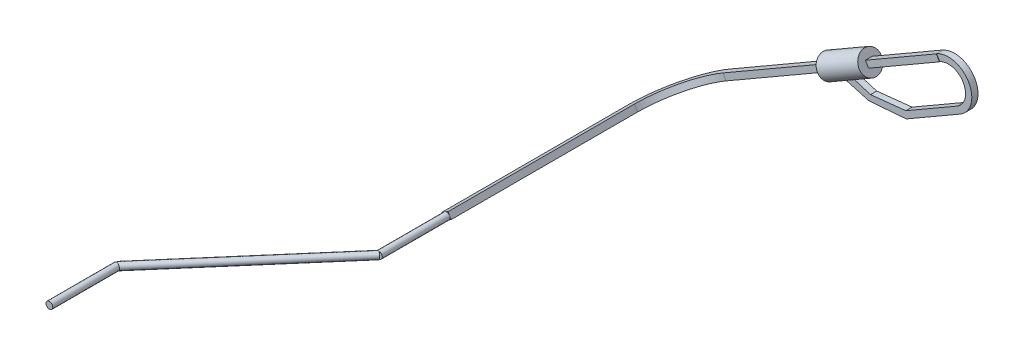
ISO-10303-21;
HEADER;
FILE_DESCRIPTION(('STEP AP214'),'2;1');
FILE_NAME('part.step','',(''),(''),'','','');
FILE_SCHEMA(('AUTOMOTIVE_DESIGN { 1 0 10303 214 1 1 1 1 }'));
ENDSEC;
DATA;
#1=APPLICATION_CONTEXT('core data for automotive mechanical design processes');
#2=APPLICATION_PROTOCOL_DEFINITION('international standard','automotive_design',2000,#1);
#3=PRODUCT_CONTEXT('',#1,'mechanical');
#4=PRODUCT('Part','Part','',(#3));
#5=PRODUCT_RELATED_PRODUCT_CATEGORY('part','',(#4));
#6=PRODUCT_DEFINITION_FORMATION('','',#4);
#7=PRODUCT_DEFINITION_CONTEXT('part definition',#1,'design');
#8=PRODUCT_DEFINITION('design','',#6,#7);
#9=PRODUCT_DEFINITION_SHAPE('','',#8);
#10=(LENGTH_UNIT() NAMED_UNIT(*) SI_UNIT(.MILLI.,.METRE.));
#11=(NAMED_UNIT(*) PLANE_ANGLE_UNIT() SI_UNIT($,.RADIAN.));
#12=(NAMED_UNIT(*) SI_UNIT($,.STERADIAN.) SOLID_ANGLE_UNIT());
#13=UNCERTAINTY_MEASURE_WITH_UNIT(LENGTH_MEASURE(1.E-05),#10,'distance_accuracy_value','');
#14=(GEOMETRIC_REPRESENTATION_CONTEXT(3) GLOBAL_UNCERTAINTY_ASSIGNED_CONTEXT((#13)) GLOBAL_UNIT_ASSIGNED_CONTEXT((#10,
#11,#12)) REPRESENTATION_CONTEXT('',''));
#15=CARTESIAN_POINT('',(0.,0.,0.));
#16=DIRECTION('',(0.,0.,1.));
#17=DIRECTION('',(1.,0.,0.));
#18=AXIS2_PLACEMENT_3D('',#15,#16,#17);
#19=CARTESIAN_POINT('',(34.0499907475931,-10.9763139720814,-45.));
#20=DIRECTION('',(0.5,-0.866025403784439,0.));
#21=DIRECTION('',(0.866025403784439,0.5,0.));
#22=AXIS2_PLACEMENT_3D('',#19,#20,#21);
#23=PLANE('',#22);
#24=DIRECTION('',(0.866025403784438,0.5,0.));
#25=VECTOR('',#24,1.);
#26=CARTESIAN_POINT('',(34.0499907475931,-10.9763139720814,-54.6));
#27=LINE('',#26,#25);
#28=CARTESIAN_POINT('',(34.0499907475931,-10.9763139720814,-54.6));
#29=VERTEX_POINT('',#28);
#30=CARTESIAN_POINT('',(51.8888155161281,-0.677063689941202,-54.6));
#31=VERTEX_POINT('',#30);
#32=EDGE_CURVE('E345',#29,#31,#27,.T.);
#33=ORIENTED_EDGE('',*,*,#32,.T.);
#34=DIRECTION('',(0.,0.,1.));
#35=VECTOR('',#34,1.);
#36=CARTESIAN_POINT('',(51.8888155161281,-0.677063689941203,-45.));
#37=LINE('',#36,#35);
#38=CARTESIAN_POINT('',(51.8888155161281,-0.677063689941205,-53.4));
#39=VERTEX_POINT('',#38);
#40=EDGE_CURVE('E63',#31,#39,#37,.T.);
#41=ORIENTED_EDGE('',*,*,#40,.T.);
#42=DIRECTION('',(-0.866025403784438,-0.5,0.));
#43=VECTOR('',#42,1.);
#44=CARTESIAN_POINT('',(71.8073998031702,10.8229363100588,-53.4));
#45=LINE('',#44,#43);
#46=CARTESIAN_POINT('',(34.0499907475931,-10.9763139720814,-53.4));
#47=VERTEX_POINT('',#46);
#48=EDGE_CURVE('E340',#39,#47,#45,.T.);
#49=ORIENTED_EDGE('',*,*,#48,.T.);
#50=CARTESIAN_POINT('',(34.0499907475931,-10.9763139720814,-45.));
#51=DIRECTION('',(-0.5,0.866025403784439,0.));
#52=DIRECTION('',(-0.866025403784439,-0.5,0.));
#53=AXIS2_PLACEMENT_3D('',#50,#51,#52);
#54=CIRCLE('',#53,8.4);
#55=CARTESIAN_POINT('',(26.7753773558038,-15.1763139720814,-45.));
#56=VERTEX_POINT('',#55);
#57=EDGE_CURVE('E335',#47,#56,#54,.T.);
#58=ORIENTED_EDGE('',*,*,#57,.T.);
#59=DIRECTION('',(0.,0.,1.));
#60=VECTOR('',#59,1.);
#61=CARTESIAN_POINT('',(26.7753773558038,-15.1763139720814,-45.));
#62=LINE('',#61,#60);
#63=CARTESIAN_POINT('',(26.7753773558038,-15.1763139720814,-12.));
#64=VERTEX_POINT('',#63);
#65=EDGE_CURVE('E329',#56,#64,#62,.T.);
#66=ORIENTED_EDGE('',*,*,#65,.T.);
#67=DIRECTION('',(-0.866025403784438,-0.500000000000001,0.));
#68=VECTOR('',#67,1.);
#69=CARTESIAN_POINT('',(26.7753773558038,-15.1763139720814,-12.));
#70=LINE('',#69,#68);
#71=CARTESIAN_POINT('',(26.4634277101061,-15.3564181839987,-12.));
#72=VERTEX_POINT('',#71);
#73=EDGE_CURVE('E349',#64,#72,#70,.T.);
#74=ORIENTED_EDGE('',*,*,#73,.T.);
#75=CARTESIAN_POINT('',(26.0480965169602,-15.5962097601643,-12.));
#76=VERTEX_POINT('',#75);
#77=EDGE_CURVE('E250',#72,#76,#70,.T.);
#78=ORIENTED_EDGE('',*,*,#77,.T.);
#79=CARTESIAN_POINT('',(25.7361468712625,-15.7763139720814,-12.));
#80=VERTEX_POINT('',#79);
#81=EDGE_CURVE('E313',#76,#80,#70,.T.);
#82=ORIENTED_EDGE('',*,*,#81,.T.);
#83=DIRECTION('',(0.,0.,-1.));
#84=VECTOR('',#83,1.);
#85=CARTESIAN_POINT('',(25.7361468712625,-15.7763139720814,-12.));
#86=LINE('',#85,#84);
#87=CARTESIAN_POINT('',(25.7361468712625,-15.7763139720814,-45.));
#88=VERTEX_POINT('',#87);
#89=EDGE_CURVE('E350',#80,#88,#86,.T.);
#90=ORIENTED_EDGE('',*,*,#89,.T.);
#91=CARTESIAN_POINT('',(34.0499907475931,-10.9763139720814,-45.));
#92=DIRECTION('',(0.5,-0.866025403784439,0.));
#93=DIRECTION('',(0.866025403784439,0.5,0.));
#94=AXIS2_PLACEMENT_3D('',#91,#92,#93);
#95=CIRCLE('',#94,9.6);
#96=EDGE_CURVE('E344',#88,#29,#95,.T.);
#97=ORIENTED_EDGE('',*,*,#96,.T.);
#98=EDGE_LOOP('',(#33,#41,#49,#58,#66,#74,#78,#82,#90,#97));
#99=FACE_BOUND('',#98,.T.);
#100=ADVANCED_FACE('F39',(#99),#23,.T.);
#101=CARTESIAN_POINT('',(34.0499907475931,-10.9763139720814,-54.6));
#102=DIRECTION('',(0.,0.,1.));
#103=DIRECTION('',(1.,0.,0.));
#104=AXIS2_PLACEMENT_3D('',#101,#102,#103);
#105=PLANE('',#104);
#106=DIRECTION('',(-0.5,0.866025403784439,0.));
#107=VECTOR('',#106,1.);
#108=CARTESIAN_POINT('',(51.8888155161281,-0.677063689941203,-54.6));
#109=LINE('',#108,#107);
#110=CARTESIAN_POINT('',(51.3388155161281,0.275564254221681,-54.6));
#111=VERTEX_POINT('',#110);
#112=EDGE_CURVE('E53',#31,#111,#109,.T.);
#113=ORIENTED_EDGE('',*,*,#112,.F.);
#114=ORIENTED_EDGE('',*,*,#32,.F.);
#115=DIRECTION('',(-0.5,0.866025403784438,0.));
#116=VECTOR('',#115,1.);
#117=CARTESIAN_POINT('',(34.0499907475931,-10.9763139720814,-54.6));
#118=LINE('',#117,#116);
#119=CARTESIAN_POINT('',(33.4999907475931,-10.0236860279186,-54.6));
#120=VERTEX_POINT('',#119);
#121=EDGE_CURVE('E287',#29,#120,#118,.T.);
#122=ORIENTED_EDGE('',*,*,#121,.T.);
#123=DIRECTION('',(0.866025403784438,0.5,0.));
#124=VECTOR('',#123,1.);
#125=CARTESIAN_POINT('',(33.4999907475931,-10.0236860279186,-54.6));
#126=LINE('',#125,#124);
#127=EDGE_CURVE('E325',#120,#111,#126,.T.);
#128=ORIENTED_EDGE('',*,*,#127,.T.);
#129=EDGE_LOOP('',(#113,#114,#122,#128));
#130=FACE_BOUND('',#129,.T.);
#131=ADVANCED_FACE('F457',(#130),#105,.F.);
#132=CARTESIAN_POINT('',(71.8073998031702,10.8229363100588,-53.4));
#133=DIRECTION('',(0.,0.,-1.));
#134=DIRECTION('',(-1.,0.,0.));
#135=AXIS2_PLACEMENT_3D('',#132,#133,#134);
#136=PLANE('',#135);
#137=DIRECTION('',(0.5,-0.866025403784439,0.));
#138=VECTOR('',#137,1.);
#139=CARTESIAN_POINT('',(51.8888155161281,-0.677063689941203,-53.4));
#140=LINE('',#139,#138);
#141=CARTESIAN_POINT('',(51.3388155161281,0.275564254221679,-53.4));
#142=VERTEX_POINT('',#141);
#143=EDGE_CURVE('E420',#142,#39,#140,.T.);
#144=ORIENTED_EDGE('',*,*,#143,.F.);
#145=DIRECTION('',(-0.866025403784438,-0.5,0.));
#146=VECTOR('',#145,1.);
#147=CARTESIAN_POINT('',(71.2573998031702,11.7755642542217,-53.4));
#148=LINE('',#147,#146);
#149=CARTESIAN_POINT('',(33.4999907475931,-10.0236860279186,-53.4));
#150=VERTEX_POINT('',#149);
#151=EDGE_CURVE('E320',#142,#150,#148,.T.);
#152=ORIENTED_EDGE('',*,*,#151,.T.);
#153=DIRECTION('',(-0.5,0.866025403784438,0.));
#154=VECTOR('',#153,1.);
#155=CARTESIAN_POINT('',(34.0499907475931,-10.9763139720814,-53.4));
#156=LINE('',#155,#154);
#157=EDGE_CURVE('E296',#47,#150,#156,.T.);
#158=ORIENTED_EDGE('',*,*,#157,.F.);
#159=ORIENTED_EDGE('',*,*,#48,.F.);
#160=EDGE_LOOP('',(#144,#152,#158,#159));
#161=FACE_BOUND('',#160,.T.);
#162=ADVANCED_FACE('F461',(#161),#136,.F.);
#163=CARTESIAN_POINT('',(33.4999907475931,-10.0236860279186,-45.));
#164=DIRECTION('',(0.5,-0.866025403784439,0.));
#165=DIRECTION('',(0.866025403784439,0.5,0.));
#166=AXIS2_PLACEMENT_3D('',#163,#164,#165);
#167=PLANE('',#166);
#168=DIRECTION('',(0.,0.,1.));
#169=VECTOR('',#168,1.);
#170=CARTESIAN_POINT('',(51.3388155161281,0.275564254221679,-45.));
#171=LINE('',#170,#169);
#172=EDGE_CURVE('E50',#111,#142,#171,.T.);
#173=ORIENTED_EDGE('',*,*,#172,.F.);
#174=ORIENTED_EDGE('',*,*,#127,.F.);
#175=CARTESIAN_POINT('',(33.4999907475931,-10.0236860279186,-45.));
#176=DIRECTION('',(0.5,-0.866025403784439,0.));
#177=DIRECTION('',(0.866025403784439,0.5,0.));
#178=AXIS2_PLACEMENT_3D('',#175,#176,#177);
#179=CIRCLE('',#178,9.6);
#180=CARTESIAN_POINT('',(25.1861468712625,-14.8236860279186,-45.));
#181=VERTEX_POINT('',#180);
#182=EDGE_CURVE('E324',#181,#120,#179,.T.);
#183=ORIENTED_EDGE('',*,*,#182,.F.);
#184=DIRECTION('',(0.,0.,-1.));
#185=VECTOR('',#184,1.);
#186=CARTESIAN_POINT('',(25.1861468712625,-14.8236860279186,-12.));
#187=LINE('',#186,#185);
#188=CARTESIAN_POINT('',(25.1861468712625,-14.8236860279186,-12.));
#189=VERTEX_POINT('',#188);
#190=EDGE_CURVE('E330',#189,#181,#187,.T.);
#191=ORIENTED_EDGE('',*,*,#190,.F.);
#192=DIRECTION('',(-0.866025403784438,-0.500000000000001,0.));
#193=VECTOR('',#192,1.);
#194=CARTESIAN_POINT('',(26.2253773558038,-14.2236860279186,-12.));
#195=LINE('',#194,#193);
#196=CARTESIAN_POINT('',(25.4980965169602,-14.6435818160014,-12.));
#197=VERTEX_POINT('',#196);
#198=EDGE_CURVE('E249',#197,#189,#195,.T.);
#199=ORIENTED_EDGE('',*,*,#198,.F.);
#200=CARTESIAN_POINT('',(25.9134277101061,-14.4037902398357,-12.));
#201=VERTEX_POINT('',#200);
#202=EDGE_CURVE('E242',#201,#197,#195,.T.);
#203=ORIENTED_EDGE('',*,*,#202,.F.);
#204=CARTESIAN_POINT('',(26.2253773558038,-14.2236860279186,-12.));
#205=VERTEX_POINT('',#204);
#206=EDGE_CURVE('E247',#205,#201,#195,.T.);
#207=ORIENTED_EDGE('',*,*,#206,.F.);
#208=DIRECTION('',(0.,0.,1.));
#209=VECTOR('',#208,1.);
#210=CARTESIAN_POINT('',(26.2253773558038,-14.2236860279186,-45.));
#211=LINE('',#210,#209);
#212=CARTESIAN_POINT('',(26.2253773558038,-14.2236860279186,-45.));
#213=VERTEX_POINT('',#212);
#214=EDGE_CURVE('E306',#213,#205,#211,.T.);
#215=ORIENTED_EDGE('',*,*,#214,.F.);
#216=CARTESIAN_POINT('',(33.4999907475931,-10.0236860279186,-45.));
#217=DIRECTION('',(-0.5,0.866025403784439,0.));
#218=DIRECTION('',(-0.866025403784439,-0.5,0.));
#219=AXIS2_PLACEMENT_3D('',#216,#217,#218);
#220=CIRCLE('',#219,8.4);
#221=EDGE_CURVE('E315',#150,#213,#220,.T.);
#222=ORIENTED_EDGE('',*,*,#221,.F.);
#223=ORIENTED_EDGE('',*,*,#151,.F.);
#224=EDGE_LOOP('',(#173,#174,#183,#191,#199,#203,#207,#215,#222,#223));
#225=FACE_BOUND('',#224,.T.);
#226=ADVANCED_FACE('F587',(#225),#167,.F.);
#227=CARTESIAN_POINT('',(25.9807621135332,-15.,-12.));
#228=DIRECTION('',(0.,0.,1.));
#229=DIRECTION('',(1.,0.,0.));
#230=AXIS2_PLACEMENT_3D('',#227,#228,#229);
#231=PLANE('',#230);
#232=ORIENTED_EDGE('',*,*,#77,.F.);
#233=CARTESIAN_POINT('',(25.9807621135332,-15.,-12.));
#234=DIRECTION('',(0.,0.,1.));
#235=DIRECTION('',(1.,0.,0.));
#236=AXIS2_PLACEMENT_3D('',#233,#234,#235);
#237=CIRCLE('',#236,0.6);
#238=EDGE_CURVE('E693',#76,#72,#237,.T.);
#239=ORIENTED_EDGE('',*,*,#238,.F.);
#240=EDGE_LOOP('',(#232,#239));
#241=FACE_BOUND('',#240,.T.);
#242=ADVANCED_FACE('F594',(#241),#231,.F.);
#243=CARTESIAN_POINT('',(5.61909890123868,-13.9077578185018,25.9598688092173));
#244=DIRECTION('',(0.616820438897036,-0.0330875378277926,-0.78640813894527));
#245=DIRECTION('',(-0.786838966705355,0.,-0.61715835931635));
#246=AXIS2_PLACEMENT_3D('',#243,#244,#245);
#247=CYLINDRICAL_SURFACE('',#246,0.6);
#248=CARTESIAN_POINT('',(5.61909890123868,-13.9077578185018,25.9598688092173));
#249=DIRECTION('',(-0.616820438897036,0.0330875378277926,0.78640813894527));
#250=DIRECTION('',(0.786838966705355,0.,0.61715835931635));
#251=AXIS2_PLACEMENT_3D('',#248,#249,#250);
#252=CIRCLE('',#251,0.6);
#253=CARTESIAN_POINT('',(5.65123794914046,-13.3086192021533,25.9598688092173));
#254=VERTEX_POINT('',#253);
#255=CARTESIAN_POINT('',(5.58695985333686,-14.5068964348503,25.9598688092173));
#256=VERTEX_POINT('',#255);
#257=EDGE_CURVE('E270',#254,#256,#252,.T.);
#258=ORIENTED_EDGE('',*,*,#257,.F.);
#259=CARTESIAN_POINT('',(5.61909890123869,-13.9077578185018,25.9598688092173));
#260=DIRECTION('',(0.326327304626646,-0.0175048788191633,-0.945094741003586));
#261=DIRECTION('',(-0.943737925738515,0.0506240752547568,-0.326796466516034));
#262=AXIS2_PLACEMENT_3D('',#259,#260,#261);
#263=ELLIPSE('',#262,0.634856987314167,0.6);
#264=EDGE_CURVE('E265',#254,#256,#263,.T.);
#265=ORIENTED_EDGE('',*,*,#264,.T.);
#266=EDGE_LOOP('',(#258,#265));
#267=FACE_BOUND('',#266,.T.);
#268=CARTESIAN_POINT('',(25.9807621135332,-15.,0.));
#269=DIRECTION('',(0.326327304626646,-0.0175048788191633,-0.945094741003586));
#270=DIRECTION('',(0.943737925738515,-0.0506240752547568,0.326796466516034));
#271=AXIS2_PLACEMENT_3D('',#268,#269,#270);
#272=ELLIPSE('',#271,0.634856987314167,0.6);
#273=CARTESIAN_POINT('',(25.9486230656314,-15.5991386163485,0.));
#274=VERTEX_POINT('',#273);
#275=CARTESIAN_POINT('',(26.012901161435,-14.4008613836515,0.));
#276=VERTEX_POINT('',#275);
#277=EDGE_CURVE('E271',#274,#276,#272,.T.);
#278=ORIENTED_EDGE('',*,*,#277,.F.);
#279=CARTESIAN_POINT('',(25.9807621135332,-15.,0.));
#280=DIRECTION('',(-0.616820438897036,0.0330875378277926,0.78640813894527));
#281=DIRECTION('',(0.786838966705355,0.,0.61715835931635));
#282=AXIS2_PLACEMENT_3D('',#279,#280,#281);
#283=CIRCLE('',#282,0.6);
#284=EDGE_CURVE('E268',#274,#276,#283,.T.);
#285=ORIENTED_EDGE('',*,*,#284,.T.);
#286=EDGE_LOOP('',(#278,#285));
#287=FACE_BOUND('',#286,.T.);
#288=ADVANCED_FACE('F715',(#267,#287),#247,.T.);
#289=CARTESIAN_POINT('',(5.61909890123868,-13.9077578185018,37.9598688092173));
#290=DIRECTION('',(0.,0.,-1.));
#291=DIRECTION('',(-1.,0.,0.));
#292=AXIS2_PLACEMENT_3D('',#289,#290,#291);
#293=CYLINDRICAL_SURFACE('',#292,0.6);
#294=CARTESIAN_POINT('',(5.61909890123868,-13.9077578185018,37.9598688092173));
#295=DIRECTION('',(0.,0.,1.));
#296=DIRECTION('',(1.,0.,0.));
#297=AXIS2_PLACEMENT_3D('',#294,#295,#296);
#298=CIRCLE('',#297,0.6);
#299=CARTESIAN_POINT('',(6.21909890123868,-13.9077578185018,37.9598688092173));
#300=VERTEX_POINT('',#299);
#301=EDGE_CURVE('E256',#300,#300,#298,.T.);
#302=ORIENTED_EDGE('',*,*,#301,.F.);
#303=EDGE_LOOP('',(#302));
#304=FACE_BOUND('',#303,.T.);
#305=ORIENTED_EDGE('',*,*,#264,.F.);
#306=CARTESIAN_POINT('',(5.61909890123868,-13.9077578185018,25.9598688092173));
#307=DIRECTION('',(0.,0.,1.));
#308=DIRECTION('',(1.,0.,0.));
#309=AXIS2_PLACEMENT_3D('',#306,#307,#308);
#310=CIRCLE('',#309,0.6);
#311=EDGE_CURVE('E259',#254,#256,#310,.T.);
#312=ORIENTED_EDGE('',*,*,#311,.T.);
#313=EDGE_LOOP('',(#305,#312));
#314=FACE_BOUND('',#313,.T.);
#315=ADVANCED_FACE('F41',(#304,#314),#293,.T.);
#316=CARTESIAN_POINT('',(5.61909890123868,-13.9077578185018,37.9598688092173));
#317=DIRECTION('',(0.,0.,1.));
#318=DIRECTION('',(1.,0.,0.));
#319=AXIS2_PLACEMENT_3D('',#316,#317,#318);
#320=PLANE('',#319);
#321=ORIENTED_EDGE('',*,*,#301,.T.);
#322=EDGE_LOOP('',(#321));
#323=FACE_BOUND('',#322,.T.);
#324=ADVANCED_FACE('F861',(#323),#320,.T.);
#325=CARTESIAN_POINT('',(5.61909890123868,-13.9077578185018,25.9598688092173));
#326=DIRECTION('',(0.,0.,1.));
#327=DIRECTION('',(1.,0.,0.));
#328=AXIS2_PLACEMENT_3D('',#325,#326,#327);
#329=PLANE('',#328);
#330=ORIENTED_EDGE('',*,*,#311,.F.);
#331=DIRECTION('',(-0.0535650798363343,-0.998564360580793,0.));
#332=VECTOR('',#331,1.);
#333=CARTESIAN_POINT('',(5.61909890123866,-13.9077578185018,25.9598688092173));
#334=LINE('',#333,#332);
#335=EDGE_CURVE('E254',#254,#256,#334,.T.);
#336=ORIENTED_EDGE('',*,*,#335,.T.);
#337=EDGE_LOOP('',(#330,#336));
#338=FACE_BOUND('',#337,.T.);
#339=ADVANCED_FACE('F852',(#338),#329,.F.);
#340=CARTESIAN_POINT('',(5.61909890123868,-13.9077578185018,25.9598688092173));
#341=DIRECTION('',(-0.616820438897036,0.0330875378277926,0.78640813894527));
#342=DIRECTION('',(0.786838966705355,0.,0.61715835931635));
#343=AXIS2_PLACEMENT_3D('',#340,#341,#342);
#344=PLANE('',#343);
#345=ORIENTED_EDGE('',*,*,#335,.F.);
#346=ORIENTED_EDGE('',*,*,#257,.T.);
#347=EDGE_LOOP('',(#345,#346));
#348=FACE_BOUND('',#347,.T.);
#349=ADVANCED_FACE('F848',(#348),#344,.T.);
#350=CARTESIAN_POINT('',(25.9807621135332,-15.,0.));
#351=DIRECTION('',(-0.616820438897036,0.0330875378277926,0.78640813894527));
#352=DIRECTION('',(0.786838966705355,0.,0.61715835931635));
#353=AXIS2_PLACEMENT_3D('',#350,#351,#352);
#354=PLANE('',#353);
#355=ORIENTED_EDGE('',*,*,#284,.F.);
#356=DIRECTION('',(0.0535650798363343,0.998564360580793,0.));
#357=VECTOR('',#356,1.);
#358=CARTESIAN_POINT('',(25.9807621135332,-15.,0.));
#359=LINE('',#358,#357);
#360=EDGE_CURVE('E252',#274,#276,#359,.T.);
#361=ORIENTED_EDGE('',*,*,#360,.T.);
#362=EDGE_LOOP('',(#355,#361));
#363=FACE_BOUND('',#362,.T.);
#364=ADVANCED_FACE('F835',(#363),#354,.F.);
#365=CARTESIAN_POINT('',(25.9807621135332,-15.,0.));
#366=DIRECTION('',(0.,0.,-1.));
#367=DIRECTION('',(-1.,0.,0.));
#368=AXIS2_PLACEMENT_3D('',#365,#366,#367);
#369=CYLINDRICAL_SURFACE('',#368,0.6);
#370=CARTESIAN_POINT('',(26.5003773558038,-14.7,-12.));
#371=VERTEX_POINT('',#370);
#372=EDGE_CURVE('E277',#371,#201,#237,.T.);
#373=ORIENTED_EDGE('',*,*,#372,.T.);
#374=EDGE_CURVE('E276',#201,#197,#237,.T.);
#375=ORIENTED_EDGE('',*,*,#374,.T.);
#376=CARTESIAN_POINT('',(25.4611468712625,-15.3,-12.));
#377=VERTEX_POINT('',#376);
#378=EDGE_CURVE('E688',#197,#377,#237,.T.);
#379=ORIENTED_EDGE('',*,*,#378,.T.);
#380=EDGE_CURVE('E689',#377,#76,#237,.T.);
#381=ORIENTED_EDGE('',*,*,#380,.T.);
#382=ORIENTED_EDGE('',*,*,#238,.T.);
#383=EDGE_CURVE('E278',#72,#371,#237,.T.);
#384=ORIENTED_EDGE('',*,*,#383,.T.);
#385=EDGE_LOOP('',(#373,#375,#379,#381,#382,#384));
#386=FACE_BOUND('',#385,.T.);
#387=CARTESIAN_POINT('',(25.9807621135332,-15.,0.));
#388=DIRECTION('',(0.,0.,1.));
#389=DIRECTION('',(1.,0.,0.));
#390=AXIS2_PLACEMENT_3D('',#387,#388,#389);
#391=CIRCLE('',#390,0.6);
#392=EDGE_CURVE('E274',#274,#276,#391,.T.);
#393=ORIENTED_EDGE('',*,*,#392,.F.);
#394=ORIENTED_EDGE('',*,*,#277,.T.);
#395=EDGE_LOOP('',(#393,#394));
#396=FACE_BOUND('',#395,.T.);
#397=ADVANCED_FACE('F695',(#386,#396),#369,.T.);
#398=CARTESIAN_POINT('',(25.9807621135332,-15.,0.));
#399=DIRECTION('',(0.,0.,1.));
#400=DIRECTION('',(1.,0.,0.));
#401=AXIS2_PLACEMENT_3D('',#398,#399,#400);
#402=PLANE('',#401);
#403=ORIENTED_EDGE('',*,*,#360,.F.);
#404=ORIENTED_EDGE('',*,*,#392,.T.);
#405=EDGE_LOOP('',(#403,#404));
#406=FACE_BOUND('',#405,.T.);
#407=ADVANCED_FACE('F699',(#406),#402,.T.);
#408=ORIENTED_EDGE('',*,*,#374,.F.);
#409=ORIENTED_EDGE('',*,*,#202,.T.);
#410=EDGE_LOOP('',(#408,#409));
#411=FACE_BOUND('',#410,.T.);
#412=ADVANCED_FACE('F700',(#411),#231,.F.);
#413=CARTESIAN_POINT('',(26.7753773558038,-15.1763139720814,-12.));
#414=DIRECTION('',(0.,0.,-1.));
#415=DIRECTION('',(-1.,0.,0.));
#416=AXIS2_PLACEMENT_3D('',#413,#414,#415);
#417=PLANE('',#416);
#418=ORIENTED_EDGE('',*,*,#378,.F.);
#419=ORIENTED_EDGE('',*,*,#198,.T.);
#420=DIRECTION('',(-0.5,0.866025403784438,0.));
#421=VECTOR('',#420,1.);
#422=CARTESIAN_POINT('',(25.7361468712625,-15.7763139720814,-12.));
#423=LINE('',#422,#421);
#424=EDGE_CURVE('E284',#377,#189,#423,.T.);
#425=ORIENTED_EDGE('',*,*,#424,.F.);
#426=EDGE_LOOP('',(#418,#419,#425));
#427=FACE_BOUND('',#426,.T.);
#428=ADVANCED_FACE('F684',(#427),#417,.F.);
#429=ORIENTED_EDGE('',*,*,#380,.F.);
#430=EDGE_CURVE('E285',#80,#377,#423,.T.);
#431=ORIENTED_EDGE('',*,*,#430,.F.);
#432=ORIENTED_EDGE('',*,*,#81,.F.);
#433=EDGE_LOOP('',(#429,#431,#432));
#434=FACE_BOUND('',#433,.T.);
#435=ADVANCED_FACE('F704',(#434),#417,.F.);
#436=ORIENTED_EDGE('',*,*,#372,.F.);
#437=DIRECTION('',(-0.5,0.866025403784438,0.));
#438=VECTOR('',#437,1.);
#439=CARTESIAN_POINT('',(26.7753773558038,-15.1763139720814,-12.));
#440=LINE('',#439,#438);
#441=EDGE_CURVE('E307',#371,#205,#440,.T.);
#442=ORIENTED_EDGE('',*,*,#441,.T.);
#443=ORIENTED_EDGE('',*,*,#206,.T.);
#444=EDGE_LOOP('',(#436,#442,#443));
#445=FACE_BOUND('',#444,.T.);
#446=ADVANCED_FACE('F668',(#445),#417,.F.);
#447=ORIENTED_EDGE('',*,*,#383,.F.);
#448=ORIENTED_EDGE('',*,*,#73,.F.);
#449=EDGE_CURVE('E302',#64,#371,#440,.T.);
#450=ORIENTED_EDGE('',*,*,#449,.T.);
#451=EDGE_LOOP('',(#447,#448,#450));
#452=FACE_BOUND('',#451,.T.);
#453=ADVANCED_FACE('F669',(#452),#417,.F.);
#454=CARTESIAN_POINT('',(25.7361468712625,-15.7763139720814,-12.));
#455=DIRECTION('',(0.866025403784438,0.5,0.));
#456=DIRECTION('',(-0.5,0.866025403784438,0.));
#457=AXIS2_PLACEMENT_3D('',#454,#455,#456);
#458=PLANE('',#457);
#459=ORIENTED_EDGE('',*,*,#190,.T.);
#460=DIRECTION('',(-0.5,0.866025403784438,0.));
#461=VECTOR('',#460,1.);
#462=CARTESIAN_POINT('',(25.7361468712625,-15.7763139720814,-45.));
#463=LINE('',#462,#461);
#464=EDGE_CURVE('E288',#88,#181,#463,.T.);
#465=ORIENTED_EDGE('',*,*,#464,.F.);
#466=ORIENTED_EDGE('',*,*,#89,.F.);
#467=ORIENTED_EDGE('',*,*,#430,.T.);
#468=ORIENTED_EDGE('',*,*,#424,.T.);
#469=EDGE_LOOP('',(#459,#465,#466,#467,#468));
#470=FACE_BOUND('',#469,.T.);
#471=ADVANCED_FACE('F649',(#470),#458,.F.);
#472=CARTESIAN_POINT('',(34.0499907475931,-10.9763139720814,-45.));
#473=DIRECTION('',(-0.5,0.866025403784438,0.));
#474=DIRECTION('',(-0.866025403784438,-0.5,0.));
#475=AXIS2_PLACEMENT_3D('',#472,#473,#474);
#476=CYLINDRICAL_SURFACE('',#475,9.6);
#477=ORIENTED_EDGE('',*,*,#182,.T.);
#478=ORIENTED_EDGE('',*,*,#121,.F.);
#479=ORIENTED_EDGE('',*,*,#96,.F.);
#480=ORIENTED_EDGE('',*,*,#464,.T.);
#481=EDGE_LOOP('',(#477,#478,#479,#480));
#482=FACE_BOUND('',#481,.T.);
#483=ADVANCED_FACE('F642',(#482),#476,.T.);
#484=CARTESIAN_POINT('',(34.0499907475931,-10.9763139720814,-45.));
#485=DIRECTION('',(-0.5,0.866025403784438,0.));
#486=DIRECTION('',(-0.866025403784438,-0.5,0.));
#487=AXIS2_PLACEMENT_3D('',#484,#485,#486);
#488=CYLINDRICAL_SURFACE('',#487,8.4);
#489=ORIENTED_EDGE('',*,*,#221,.T.);
#490=DIRECTION('',(-0.5,0.866025403784438,0.));
#491=VECTOR('',#490,1.);
#492=CARTESIAN_POINT('',(26.7753773558038,-15.1763139720814,-45.));
#493=LINE('',#492,#491);
#494=EDGE_CURVE('E303',#56,#213,#493,.T.);
#495=ORIENTED_EDGE('',*,*,#494,.F.);
#496=ORIENTED_EDGE('',*,*,#57,.F.);
#497=ORIENTED_EDGE('',*,*,#157,.T.);
#498=EDGE_LOOP('',(#489,#495,#496,#497));
#499=FACE_BOUND('',#498,.T.);
#500=ADVANCED_FACE('F645',(#499),#488,.F.);
#501=CARTESIAN_POINT('',(26.7753773558038,-15.1763139720814,-45.));
#502=DIRECTION('',(-0.866025403784438,-0.5,0.));
#503=DIRECTION('',(0.5,-0.866025403784438,0.));
#504=AXIS2_PLACEMENT_3D('',#501,#502,#503);
#505=PLANE('',#504);
#506=ORIENTED_EDGE('',*,*,#214,.T.);
#507=ORIENTED_EDGE('',*,*,#441,.F.);
#508=ORIENTED_EDGE('',*,*,#449,.F.);
#509=ORIENTED_EDGE('',*,*,#65,.F.);
#510=ORIENTED_EDGE('',*,*,#494,.T.);
#511=EDGE_LOOP('',(#506,#507,#508,#509,#510));
#512=FACE_BOUND('',#511,.T.);
#513=ADVANCED_FACE('F434',(#512),#505,.F.);
#514=CARTESIAN_POINT('',(58.9750314482958,4.04925028214023,-54.));
#515=DIRECTION('',(-0.866025403784439,-0.5,0.));
#516=DIRECTION('',(0.5,-0.866025403784439,0.));
#517=AXIS2_PLACEMENT_3D('',#514,#515,#516);
#518=CYLINDRICAL_SURFACE('',#517,2.);
#519=CARTESIAN_POINT('',(58.9750314482958,4.04925028214023,-54.));
#520=DIRECTION('',(0.866025403784439,0.5,0.));
#521=DIRECTION('',(-0.5,0.866025403784439,0.));
#522=AXIS2_PLACEMENT_3D('',#519,#520,#521);
#523=CIRCLE('',#522,2.);
#524=CARTESIAN_POINT('',(57.9750314482958,5.78130108970911,-54.));
#525=VERTEX_POINT('',#524);
#526=EDGE_CURVE('E424',#525,#525,#523,.T.);
#527=ORIENTED_EDGE('',*,*,#526,.F.);
#528=EDGE_LOOP('',(#527));
#529=FACE_BOUND('',#528,.T.);
#530=CARTESIAN_POINT('',(51.6138155161281,-0.200749717859772,-54.));
#531=DIRECTION('',(0.866025403784439,0.5,0.));
#532=DIRECTION('',(-0.5,0.866025403784439,0.));
#533=AXIS2_PLACEMENT_3D('',#530,#531,#532);
#534=CIRCLE('',#533,2.);
#535=CARTESIAN_POINT('',(50.6138155161281,1.53130108970911,-54.));
#536=VERTEX_POINT('',#535);
#537=EDGE_CURVE('E422',#536,#536,#534,.T.);
#538=ORIENTED_EDGE('',*,*,#537,.T.);
#539=EDGE_LOOP('',(#538));
#540=FACE_BOUND('',#539,.T.);
#541=DIRECTION('',(-0.866025403784439,-0.5,0.));
#542=VECTOR('',#541,1.);
#543=CARTESIAN_POINT('',(59.9364756744473,2.38398003380214,-53.45));
#544=LINE('',#543,#542);
#545=CARTESIAN_POINT('',(55.2560421842977,-0.318269501659858,-53.45));
#546=VERTEX_POINT('',#545);
#547=CARTESIAN_POINT('',(56.7167571594096,0.525074682430314,-53.45));
#548=VERTEX_POINT('',#547);
#549=EDGE_CURVE('E232',#546,#548,#544,.F.);
#550=ORIENTED_EDGE('',*,*,#549,.T.);
#551=CARTESIAN_POINT('',(54.2118917274814,1.29925028214021,-54.));
#552=DIRECTION('',(-0.295286936198048,-0.955408616933493,0.));
#553=DIRECTION('',(-0.955408616933493,0.295286936198048,0.));
#554=AXIS2_PLACEMENT_3D('',#551,#552,#553);
#555=ELLIPSE('',#554,2.72691216768267,2.);
#556=CARTESIAN_POINT('',(56.7167571594096,0.525074682430315,-54.55));
#557=VERTEX_POINT('',#556);
#558=EDGE_CURVE('E239',#548,#557,#555,.F.);
#559=ORIENTED_EDGE('',*,*,#558,.T.);
#560=DIRECTION('',(-0.866025403784439,-0.5,0.));
#561=VECTOR('',#560,1.);
#562=CARTESIAN_POINT('',(59.9364756744473,2.38398003380214,-54.55));
#563=LINE('',#562,#561);
#564=CARTESIAN_POINT('',(55.2560421842977,-0.318269501659857,-54.55));
#565=VERTEX_POINT('',#564);
#566=EDGE_CURVE('E238',#565,#557,#563,.F.);
#567=ORIENTED_EDGE('',*,*,#566,.F.);
#568=CARTESIAN_POINT('',(52.6699440573286,0.409006379701189,-54.));
#569=DIRECTION('',(0.270723424827323,0.962657170154446,0.));
#570=DIRECTION('',(-0.962657170154446,0.270723424827323,0.));
#571=AXIS2_PLACEMENT_3D('',#568,#569,#570);
#572=ELLIPSE('',#571,2.79414702275506,2.);
#573=EDGE_CURVE('E224',#565,#546,#572,.F.);
#574=ORIENTED_EDGE('',*,*,#573,.T.);
#575=EDGE_LOOP('',(#550,#559,#567,#574));
#576=FACE_BOUND('',#575,.T.);
#577=ADVANCED_FACE('F241',(#529,#540,#576),#518,.T.);
#578=CARTESIAN_POINT('',(58.9750314482958,4.04925028214023,-54.));
#579=DIRECTION('',(0.866025403784439,0.5,0.));
#580=DIRECTION('',(-0.5,0.866025403784439,0.));
#581=AXIS2_PLACEMENT_3D('',#578,#579,#580);
#582=PLANE('',#581);
#583=DIRECTION('',(-0.5,0.866025403784439,0.));
#584=VECTOR('',#583,1.);
#585=CARTESIAN_POINT('',(59.2500314482958,3.5729363100588,-54.6));
#586=LINE('',#585,#584);
#587=CARTESIAN_POINT('',(59.2500314482958,3.5729363100588,-54.6));
#588=VERTEX_POINT('',#587);
#589=CARTESIAN_POINT('',(58.7000314482958,4.52556425422168,-54.6));
#590=VERTEX_POINT('',#589);
#591=EDGE_CURVE('E413',#588,#590,#586,.T.);
#592=ORIENTED_EDGE('',*,*,#591,.F.);
#593=DIRECTION('',(0.,0.,1.));
#594=VECTOR('',#593,1.);
#595=CARTESIAN_POINT('',(59.2500314482958,3.5729363100588,-45.));
#596=LINE('',#595,#594);
#597=CARTESIAN_POINT('',(59.2500314482958,3.5729363100588,-53.4));
#598=VERTEX_POINT('',#597);
#599=EDGE_CURVE('E397',#588,#598,#596,.T.);
#600=ORIENTED_EDGE('',*,*,#599,.T.);
#601=DIRECTION('',(0.5,-0.866025403784439,0.));
#602=VECTOR('',#601,1.);
#603=CARTESIAN_POINT('',(59.2500314482958,3.5729363100588,-53.4));
#604=LINE('',#603,#602);
#605=CARTESIAN_POINT('',(58.7000314482958,4.52556425422168,-53.4));
#606=VERTEX_POINT('',#605);
#607=EDGE_CURVE('E412',#606,#598,#604,.T.);
#608=ORIENTED_EDGE('',*,*,#607,.F.);
#609=DIRECTION('',(0.,0.,1.));
#610=VECTOR('',#609,1.);
#611=CARTESIAN_POINT('',(58.7000314482958,4.52556425422168,-45.));
#612=LINE('',#611,#610);
#613=EDGE_CURVE('E11',#590,#606,#612,.T.);
#614=ORIENTED_EDGE('',*,*,#613,.F.);
#615=EDGE_LOOP('',(#592,#600,#608,#614));
#616=FACE_BOUND('',#615,.T.);
#617=ORIENTED_EDGE('',*,*,#526,.T.);
#618=EDGE_LOOP('',(#617));
#619=FACE_BOUND('',#618,.T.);
#620=ADVANCED_FACE('F431',(#616,#619),#582,.T.);
#621=CARTESIAN_POINT('',(51.6138155161281,-0.200749717859772,-54.));
#622=DIRECTION('',(0.866025403784439,0.5,0.));
#623=DIRECTION('',(-0.5,0.866025403784439,0.));
#624=AXIS2_PLACEMENT_3D('',#621,#622,#623);
#625=PLANE('',#624);
#626=ORIENTED_EDGE('',*,*,#40,.F.);
#627=ORIENTED_EDGE('',*,*,#112,.T.);
#628=ORIENTED_EDGE('',*,*,#172,.T.);
#629=ORIENTED_EDGE('',*,*,#143,.T.);
#630=EDGE_LOOP('',(#626,#627,#628,#629));
#631=FACE_BOUND('',#630,.T.);
#632=ORIENTED_EDGE('',*,*,#537,.F.);
#633=EDGE_LOOP('',(#632));
#634=FACE_BOUND('',#633,.T.);
#635=ADVANCED_FACE('F438',(#631,#634),#625,.F.);
#636=CARTESIAN_POINT('',(71.8073998031702,10.8229363100588,-54.6));
#637=DIRECTION('',(-0.866025403784438,-0.5,0.));
#638=DIRECTION('',(0.5,-0.866025403784438,0.));
#639=AXIS2_PLACEMENT_3D('',#636,#637,#638);
#640=PLANE('',#639);
#641=DIRECTION('',(0.5,-0.866025403784438,0.));
#642=VECTOR('',#641,1.);
#643=CARTESIAN_POINT('',(71.8073998031702,10.8229363100588,-53.45));
#644=LINE('',#643,#642);
#645=CARTESIAN_POINT('',(71.2573998031702,11.7755642542217,-53.45));
#646=VERTEX_POINT('',#645);
#647=CARTESIAN_POINT('',(71.8073998031702,10.8229363100588,-53.45));
#648=VERTEX_POINT('',#647);
#649=EDGE_CURVE('E355',#646,#648,#644,.T.);
#650=ORIENTED_EDGE('',*,*,#649,.F.);
#651=DIRECTION('',(0.,0.,1.));
#652=VECTOR('',#651,1.);
#653=CARTESIAN_POINT('',(71.2573998031702,11.7755642542217,-54.6));
#654=LINE('',#653,#652);
#655=CARTESIAN_POINT('',(71.2573998031702,11.7755642542217,-53.4));
#656=VERTEX_POINT('',#655);
#657=EDGE_CURVE('E321',#646,#656,#654,.T.);
#658=ORIENTED_EDGE('',*,*,#657,.T.);
#659=DIRECTION('',(-0.5,0.866025403784438,0.));
#660=VECTOR('',#659,1.);
#661=CARTESIAN_POINT('',(71.8073998031702,10.8229363100588,-53.4));
#662=LINE('',#661,#660);
#663=CARTESIAN_POINT('',(71.8073998031702,10.8229363100588,-53.4));
#664=VERTEX_POINT('',#663);
#665=EDGE_CURVE('E293',#664,#656,#662,.T.);
#666=ORIENTED_EDGE('',*,*,#665,.F.);
#667=DIRECTION('',(0.,0.,1.));
#668=VECTOR('',#667,1.);
#669=CARTESIAN_POINT('',(71.8073998031702,10.8229363100588,-54.6));
#670=LINE('',#669,#668);
#671=EDGE_CURVE('E343',#648,#664,#670,.T.);
#672=ORIENTED_EDGE('',*,*,#671,.F.);
#673=EDGE_LOOP('',(#650,#658,#666,#672));
#674=FACE_BOUND('',#673,.T.);
#675=ADVANCED_FACE('F442',(#674),#640,.F.);
#676=CARTESIAN_POINT('',(75.4073998031702,4.58755340281081,-53.45));
#677=DIRECTION('',(-0.5,0.866025403784439,0.));
#678=DIRECTION('',(-0.866025403784439,-0.5,0.));
#679=AXIS2_PLACEMENT_3D('',#676,#677,#678);
#680=PLANE('',#679);
#681=DIRECTION('',(0.866025403784439,0.5,0.));
#682=VECTOR('',#681,1.);
#683=CARTESIAN_POINT('',(75.4073998031702,4.58755340281081,-54.55));
#684=LINE('',#683,#682);
#685=CARTESIAN_POINT('',(65.8811203615413,-0.912446597189187,-54.55));
#686=VERTEX_POINT('',#685);
#687=CARTESIAN_POINT('',(75.4073998031702,4.58755340281081,-54.55));
#688=VERTEX_POINT('',#687);
#689=EDGE_CURVE('E383',#686,#688,#684,.T.);
#690=ORIENTED_EDGE('',*,*,#689,.T.);
#691=DIRECTION('',(0.,0.,-1.));
#692=VECTOR('',#691,1.);
#693=CARTESIAN_POINT('',(75.4073998031702,4.58755340281081,-53.45));
#694=LINE('',#693,#692);
#695=CARTESIAN_POINT('',(75.4073998031702,4.58755340281081,-53.45));
#696=VERTEX_POINT('',#695);
#697=EDGE_CURVE('E373',#696,#688,#694,.T.);
#698=ORIENTED_EDGE('',*,*,#697,.F.);
#699=DIRECTION('',(0.866025403784439,0.5,0.));
#700=VECTOR('',#699,1.);
#701=CARTESIAN_POINT('',(75.4073998031702,4.58755340281081,-53.45));
#702=LINE('',#701,#700);
#703=CARTESIAN_POINT('',(65.8811203615413,-0.912446597189187,-53.45));
#704=VERTEX_POINT('',#703);
#705=EDGE_CURVE('E402',#704,#696,#702,.T.);
#706=ORIENTED_EDGE('',*,*,#705,.F.);
#707=DIRECTION('',(0.,0.,-1.));
#708=VECTOR('',#707,1.);
#709=CARTESIAN_POINT('',(65.8811203615413,-0.912446597189187,-53.45));
#710=LINE('',#709,#708);
#711=EDGE_CURVE('E367',#704,#686,#710,.T.);
#712=ORIENTED_EDGE('',*,*,#711,.T.);
#713=EDGE_LOOP('',(#690,#698,#706,#712));
#714=FACE_BOUND('',#713,.T.);
#715=ADVANCED_FACE('F447',(#714),#680,.F.);
#716=CARTESIAN_POINT('',(73.3323998031702,8.18155882851623,-53.45));
#717=DIRECTION('',(0.,0.,-1.));
#718=DIRECTION('',(-1.,0.,0.));
#719=AXIS2_PLACEMENT_3D('',#716,#717,#718);
#720=CYLINDRICAL_SURFACE('',#719,4.15);
#721=CARTESIAN_POINT('',(73.3323998031702,8.18155882851623,-54.55));
#722=DIRECTION('',(0.,0.,1.));
#723=DIRECTION('',(-1.,0.,0.));
#724=AXIS2_PLACEMENT_3D('',#721,#722,#723);
#725=CIRCLE('',#724,4.15);
#726=CARTESIAN_POINT('',(71.2573998031702,11.7755642542217,-54.55));
#727=VERTEX_POINT('',#726);
#728=EDGE_CURVE('E379',#688,#727,#725,.T.);
#729=ORIENTED_EDGE('',*,*,#728,.T.);
#730=DIRECTION('',(0.,0.,-1.));
#731=VECTOR('',#730,1.);
#732=CARTESIAN_POINT('',(71.2573998031702,11.7755642542217,-53.45));
#733=LINE('',#732,#731);
#734=EDGE_CURVE('E376',#646,#727,#733,.T.);
#735=ORIENTED_EDGE('',*,*,#734,.F.);
#736=CARTESIAN_POINT('',(73.3323998031702,8.18155882851623,-53.45));
#737=DIRECTION('',(0.,0.,1.));
#738=DIRECTION('',(-1.,0.,0.));
#739=AXIS2_PLACEMENT_3D('',#736,#737,#738);
#740=CIRCLE('',#739,4.15);
#741=EDGE_CURVE('E377',#696,#646,#740,.T.);
#742=ORIENTED_EDGE('',*,*,#741,.F.);
#743=ORIENTED_EDGE('',*,*,#697,.T.);
#744=EDGE_LOOP('',(#729,#735,#742,#743));
#745=FACE_BOUND('',#744,.T.);
#746=ADVANCED_FACE('F501',(#745),#720,.T.);
#747=CARTESIAN_POINT('',(71.2573998031702,11.7755642542217,-54.6));
#748=VERTEX_POINT('',#747);
#749=EDGE_CURVE('E318',#748,#727,#654,.T.);
#750=ORIENTED_EDGE('',*,*,#749,.T.);
#751=DIRECTION('',(0.5,-0.866025403784438,0.));
#752=VECTOR('',#751,1.);
#753=CARTESIAN_POINT('',(71.8073998031702,10.8229363100588,-54.55));
#754=LINE('',#753,#752);
#755=CARTESIAN_POINT('',(71.8073998031702,10.8229363100588,-54.55));
#756=VERTEX_POINT('',#755);
#757=EDGE_CURVE('E352',#727,#756,#754,.T.);
#758=ORIENTED_EDGE('',*,*,#757,.T.);
#759=CARTESIAN_POINT('',(71.8073998031702,10.8229363100588,-54.6));
#760=VERTEX_POINT('',#759);
#761=EDGE_CURVE('E336',#760,#756,#670,.T.);
#762=ORIENTED_EDGE('',*,*,#761,.F.);
#763=DIRECTION('',(-0.5,0.866025403784438,0.));
#764=VECTOR('',#763,1.);
#765=CARTESIAN_POINT('',(71.8073998031702,10.8229363100588,-54.6));
#766=LINE('',#765,#764);
#767=EDGE_CURVE('E295',#760,#748,#766,.T.);
#768=ORIENTED_EDGE('',*,*,#767,.T.);
#769=EDGE_LOOP('',(#750,#758,#762,#768));
#770=FACE_BOUND('',#769,.T.);
#771=ADVANCED_FACE('F455',(#770),#640,.F.);
#772=EDGE_CURVE('E322',#590,#748,#126,.T.);
#773=ORIENTED_EDGE('',*,*,#772,.F.);
#774=ORIENTED_EDGE('',*,*,#613,.T.);
#775=EDGE_CURVE('E314',#656,#606,#148,.T.);
#776=ORIENTED_EDGE('',*,*,#775,.F.);
#777=ORIENTED_EDGE('',*,*,#657,.F.);
#778=ORIENTED_EDGE('',*,*,#734,.T.);
#779=ORIENTED_EDGE('',*,*,#749,.F.);
#780=EDGE_LOOP('',(#773,#774,#776,#777,#778,#779));
#781=FACE_BOUND('',#780,.T.);
#782=ADVANCED_FACE('F496',(#781),#167,.F.);
#783=ORIENTED_EDGE('',*,*,#775,.T.);
#784=ORIENTED_EDGE('',*,*,#607,.T.);
#785=EDGE_CURVE('E331',#664,#598,#45,.T.);
#786=ORIENTED_EDGE('',*,*,#785,.F.);
#787=ORIENTED_EDGE('',*,*,#665,.T.);
#788=EDGE_LOOP('',(#783,#784,#786,#787));
#789=FACE_BOUND('',#788,.T.);
#790=ADVANCED_FACE('F476',(#789),#136,.F.);
#791=EDGE_CURVE('E342',#588,#760,#27,.T.);
#792=ORIENTED_EDGE('',*,*,#791,.F.);
#793=ORIENTED_EDGE('',*,*,#591,.T.);
#794=ORIENTED_EDGE('',*,*,#772,.T.);
#795=ORIENTED_EDGE('',*,*,#767,.F.);
#796=EDGE_LOOP('',(#792,#793,#794,#795));
#797=FACE_BOUND('',#796,.T.);
#798=ADVANCED_FACE('F464',(#797),#105,.F.);
#799=ORIENTED_EDGE('',*,*,#599,.F.);
#800=ORIENTED_EDGE('',*,*,#791,.T.);
#801=ORIENTED_EDGE('',*,*,#761,.T.);
#802=DIRECTION('',(0.,0.,-1.));
#803=VECTOR('',#802,1.);
#804=CARTESIAN_POINT('',(71.8073998031702,10.8229363100588,-53.45));
#805=LINE('',#804,#803);
#806=EDGE_CURVE('E360',#648,#756,#805,.T.);
#807=ORIENTED_EDGE('',*,*,#806,.F.);
#808=ORIENTED_EDGE('',*,*,#671,.T.);
#809=ORIENTED_EDGE('',*,*,#785,.T.);
#810=EDGE_LOOP('',(#799,#800,#801,#807,#808,#809));
#811=FACE_BOUND('',#810,.T.);
#812=ADVANCED_FACE('F456',(#811),#23,.T.);
#813=CARTESIAN_POINT('',(73.3323998031702,8.18155882851623,-53.45));
#814=DIRECTION('',(0.,0.,-1.));
#815=DIRECTION('',(-1.,0.,0.));
#816=AXIS2_PLACEMENT_3D('',#813,#814,#815);
#817=CYLINDRICAL_SURFACE('',#816,3.05);
#818=CARTESIAN_POINT('',(73.3323998031702,8.18155882851623,-54.55));
#819=DIRECTION('',(0.,0.,-1.));
#820=DIRECTION('',(1.,0.,0.));
#821=AXIS2_PLACEMENT_3D('',#818,#819,#820);
#822=CIRCLE('',#821,3.05);
#823=CARTESIAN_POINT('',(74.8573998031702,5.5401813469737,-54.55));
#824=VERTEX_POINT('',#823);
#825=EDGE_CURVE('E400',#756,#824,#822,.T.);
#826=ORIENTED_EDGE('',*,*,#825,.T.);
#827=DIRECTION('',(0.,0.,-1.));
#828=VECTOR('',#827,1.);
#829=CARTESIAN_POINT('',(74.8573998031702,5.5401813469737,-53.45));
#830=LINE('',#829,#828);
#831=CARTESIAN_POINT('',(74.8573998031702,5.5401813469737,-53.45));
#832=VERTEX_POINT('',#831);
#833=EDGE_CURVE('E359',#832,#824,#830,.T.);
#834=ORIENTED_EDGE('',*,*,#833,.F.);
#835=CARTESIAN_POINT('',(73.3323998031702,8.18155882851623,-53.45));
#836=DIRECTION('',(0.,0.,-1.));
#837=DIRECTION('',(1.,0.,0.));
#838=AXIS2_PLACEMENT_3D('',#835,#836,#837);
#839=CIRCLE('',#838,3.05);
#840=EDGE_CURVE('E382',#648,#832,#839,.T.);
#841=ORIENTED_EDGE('',*,*,#840,.F.);
#842=ORIENTED_EDGE('',*,*,#806,.T.);
#843=EDGE_LOOP('',(#826,#834,#841,#842));
#844=FACE_BOUND('',#843,.T.);
#845=ADVANCED_FACE('F467',(#844),#817,.F.);
#846=CARTESIAN_POINT('',(65.8074343336228,0.315181346973697,-53.45));
#847=DIRECTION('',(0.5,-0.866025403784439,0.));
#848=DIRECTION('',(0.866025403784439,0.5,0.));
#849=AXIS2_PLACEMENT_3D('',#846,#847,#848);
#850=PLANE('',#849);
#851=DIRECTION('',(-0.866025403784439,-0.499999999999999,0.));
#852=VECTOR('',#851,1.);
#853=CARTESIAN_POINT('',(65.8074343336228,0.315181346973697,-54.55));
#854=LINE('',#853,#852);
#855=CARTESIAN_POINT('',(65.8074343336228,0.315181346973697,-54.55));
#856=VERTEX_POINT('',#855);
#857=EDGE_CURVE('E394',#824,#856,#854,.T.);
#858=ORIENTED_EDGE('',*,*,#857,.T.);
#859=DIRECTION('',(0.,0.,-1.));
#860=VECTOR('',#859,1.);
#861=CARTESIAN_POINT('',(65.8074343336228,0.315181346973697,-53.45));
#862=LINE('',#861,#860);
#863=CARTESIAN_POINT('',(65.8074343336228,0.315181346973697,-53.45));
#864=VERTEX_POINT('',#863);
#865=EDGE_CURVE('E361',#864,#856,#862,.T.);
#866=ORIENTED_EDGE('',*,*,#865,.F.);
#867=DIRECTION('',(-0.866025403784439,-0.499999999999999,0.));
#868=VECTOR('',#867,1.);
#869=CARTESIAN_POINT('',(65.8074343336228,0.315181346973697,-53.45));
#870=LINE('',#869,#868);
#871=EDGE_CURVE('E410',#832,#864,#870,.T.);
#872=ORIENTED_EDGE('',*,*,#871,.F.);
#873=ORIENTED_EDGE('',*,*,#833,.T.);
#874=EDGE_LOOP('',(#858,#866,#872,#873));
#875=FACE_BOUND('',#874,.T.);
#876=ADVANCED_FACE('F478',(#875),#850,.F.);
#877=CARTESIAN_POINT('',(59.5527882618623,-0.351453873375985,-53.45));
#878=DIRECTION('',(0.105982136439583,-0.99436803385653,0.));
#879=DIRECTION('',(0.99436803385653,0.105982136439583,0.));
#880=AXIS2_PLACEMENT_3D('',#877,#878,#879);
#881=PLANE('',#880);
#882=DIRECTION('',(-0.99436803385653,-0.105982136439583,0.));
#883=VECTOR('',#882,1.);
#884=CARTESIAN_POINT('',(59.5527882618623,-0.351453873375985,-54.55));
#885=LINE('',#884,#883);
#886=CARTESIAN_POINT('',(59.5527882618623,-0.351453873375985,-54.55));
#887=VERTEX_POINT('',#886);
#888=EDGE_CURVE('E391',#856,#887,#885,.T.);
#889=ORIENTED_EDGE('',*,*,#888,.T.);
#890=DIRECTION('',(0.,0.,-1.));
#891=VECTOR('',#890,1.);
#892=CARTESIAN_POINT('',(59.5527882618623,-0.351453873375985,-53.45));
#893=LINE('',#892,#891);
#894=CARTESIAN_POINT('',(59.5527882618623,-0.351453873375985,-53.45));
#895=VERTEX_POINT('',#894);
#896=EDGE_CURVE('E368',#895,#887,#893,.T.);
#897=ORIENTED_EDGE('',*,*,#896,.F.);
#898=DIRECTION('',(-0.99436803385653,-0.105982136439583,0.));
#899=VECTOR('',#898,1.);
#900=CARTESIAN_POINT('',(59.5527882618623,-0.351453873375985,-53.45));
#901=LINE('',#900,#899);
#902=EDGE_CURVE('E403',#864,#895,#901,.T.);
#903=ORIENTED_EDGE('',*,*,#902,.F.);
#904=ORIENTED_EDGE('',*,*,#865,.T.);
#905=EDGE_LOOP('',(#889,#897,#903,#904));
#906=FACE_BOUND('',#905,.T.);
#907=ADVANCED_FACE('F520',(#906),#881,.F.);
#908=CARTESIAN_POINT('',(65.8811203615413,-0.912446597189187,-53.45));
#909=DIRECTION('',(-0.0800646510941784,0.996789672721968,0.));
#910=DIRECTION('',(-0.996789672721968,-0.0800646510941784,0.));
#911=AXIS2_PLACEMENT_3D('',#908,#909,#910);
#912=PLANE('',#911);
#913=DIRECTION('',(0.996789672721968,0.0800646510941784,0.));
#914=VECTOR('',#913,1.);
#915=CARTESIAN_POINT('',(65.8811203615413,-0.912446597189187,-54.55));
#916=LINE('',#915,#914);
#917=CARTESIAN_POINT('',(59.2599679388347,-1.44427419640354,-54.55));
#918=VERTEX_POINT('',#917);
#919=EDGE_CURVE('E387',#918,#686,#916,.T.);
#920=ORIENTED_EDGE('',*,*,#919,.T.);
#921=ORIENTED_EDGE('',*,*,#711,.F.);
#922=DIRECTION('',(0.996789672721968,0.0800646510941784,0.));
#923=VECTOR('',#922,1.);
#924=CARTESIAN_POINT('',(65.8811203615413,-0.912446597189187,-53.45));
#925=LINE('',#924,#923);
#926=CARTESIAN_POINT('',(59.2599679388347,-1.44427419640354,-53.45));
#927=VERTEX_POINT('',#926);
#928=EDGE_CURVE('E227',#927,#704,#925,.T.);
#929=ORIENTED_EDGE('',*,*,#928,.F.);
#930=DIRECTION('',(0.,0.,-1.));
#931=VECTOR('',#930,1.);
#932=CARTESIAN_POINT('',(59.2599679388347,-1.44427419640354,-53.45));
#933=LINE('',#932,#931);
#934=EDGE_CURVE('E228',#927,#918,#933,.T.);
#935=ORIENTED_EDGE('',*,*,#934,.T.);
#936=EDGE_LOOP('',(#920,#921,#929,#935));
#937=FACE_BOUND('',#936,.T.);
#938=ADVANCED_FACE('F525',(#937),#912,.F.);
#939=CARTESIAN_POINT('',(54.2118917274814,1.29925028214021,-53.45));
#940=DIRECTION('',(-0.295286936198048,-0.955408616933493,0.));
#941=DIRECTION('',(0.955408616933493,-0.295286936198048,0.));
#942=AXIS2_PLACEMENT_3D('',#939,#940,#941);
#943=PLANE('',#942);
#944=ORIENTED_EDGE('',*,*,#558,.F.);
#945=DIRECTION('',(-0.955408616933493,0.295286936198048,0.));
#946=VECTOR('',#945,1.);
#947=CARTESIAN_POINT('',(54.2118917274814,1.29925028214021,-53.45));
#948=LINE('',#947,#946);
#949=EDGE_CURVE('E229',#895,#548,#948,.T.);
#950=ORIENTED_EDGE('',*,*,#949,.F.);
#951=ORIENTED_EDGE('',*,*,#896,.T.);
#952=DIRECTION('',(-0.955408616933493,0.295286936198048,0.));
#953=VECTOR('',#952,1.);
#954=CARTESIAN_POINT('',(54.2118917274814,1.29925028214021,-54.55));
#955=LINE('',#954,#953);
#956=EDGE_CURVE('E388',#887,#557,#955,.T.);
#957=ORIENTED_EDGE('',*,*,#956,.T.);
#958=EDGE_LOOP('',(#944,#950,#951,#957));
#959=FACE_BOUND('',#958,.T.);
#960=ADVANCED_FACE('F519',(#959),#943,.F.);
#961=CARTESIAN_POINT('',(59.2599679388347,-1.44427419640354,-53.45));
#962=DIRECTION('',(0.270723424827323,0.962657170154446,0.));
#963=DIRECTION('',(-0.962657170154446,0.270723424827323,0.));
#964=AXIS2_PLACEMENT_3D('',#961,#962,#963);
#965=PLANE('',#964);
#966=ORIENTED_EDGE('',*,*,#573,.F.);
#967=DIRECTION('',(0.962657170154446,-0.270723424827323,0.));
#968=VECTOR('',#967,1.);
#969=CARTESIAN_POINT('',(59.2599679388347,-1.44427419640354,-54.55));
#970=LINE('',#969,#968);
#971=EDGE_CURVE('E389',#565,#918,#970,.T.);
#972=ORIENTED_EDGE('',*,*,#971,.T.);
#973=ORIENTED_EDGE('',*,*,#934,.F.);
#974=DIRECTION('',(0.962657170154446,-0.270723424827323,0.));
#975=VECTOR('',#974,1.);
#976=CARTESIAN_POINT('',(59.2599679388347,-1.44427419640354,-53.45));
#977=LINE('',#976,#975);
#978=EDGE_CURVE('E218',#546,#927,#977,.T.);
#979=ORIENTED_EDGE('',*,*,#978,.F.);
#980=EDGE_LOOP('',(#966,#972,#973,#979));
#981=FACE_BOUND('',#980,.T.);
#982=ADVANCED_FACE('F222',(#981),#965,.F.);
#983=CARTESIAN_POINT('',(73.3323998031702,8.18155882851623,-54.55));
#984=DIRECTION('',(0.,0.,-1.));
#985=DIRECTION('',(-1.,0.,0.));
#986=AXIS2_PLACEMENT_3D('',#983,#984,#985);
#987=PLANE('',#986);
#988=ORIENTED_EDGE('',*,*,#971,.F.);
#989=ORIENTED_EDGE('',*,*,#566,.T.);
#990=ORIENTED_EDGE('',*,*,#956,.F.);
#991=ORIENTED_EDGE('',*,*,#888,.F.);
#992=ORIENTED_EDGE('',*,*,#857,.F.);
#993=ORIENTED_EDGE('',*,*,#825,.F.);
#994=ORIENTED_EDGE('',*,*,#757,.F.);
#995=ORIENTED_EDGE('',*,*,#728,.F.);
#996=ORIENTED_EDGE('',*,*,#689,.F.);
#997=ORIENTED_EDGE('',*,*,#919,.F.);
#998=EDGE_LOOP('',(#988,#989,#990,#991,#992,#993,#994,#995,#996,#997));
#999=FACE_BOUND('',#998,.T.);
#1000=ADVANCED_FACE('F506',(#999),#987,.T.);
#1001=CARTESIAN_POINT('',(73.3323998031702,8.18155882851623,-53.45));
#1002=DIRECTION('',(0.,0.,-1.));
#1003=DIRECTION('',(-1.,0.,0.));
#1004=AXIS2_PLACEMENT_3D('',#1001,#1002,#1003);
#1005=PLANE('',#1004);
#1006=ORIENTED_EDGE('',*,*,#549,.F.);
#1007=ORIENTED_EDGE('',*,*,#978,.T.);
#1008=ORIENTED_EDGE('',*,*,#928,.T.);
#1009=ORIENTED_EDGE('',*,*,#705,.T.);
#1010=ORIENTED_EDGE('',*,*,#741,.T.);
#1011=ORIENTED_EDGE('',*,*,#649,.T.);
#1012=ORIENTED_EDGE('',*,*,#840,.T.);
#1013=ORIENTED_EDGE('',*,*,#871,.T.);
#1014=ORIENTED_EDGE('',*,*,#902,.T.);
#1015=ORIENTED_EDGE('',*,*,#949,.T.);
#1016=EDGE_LOOP('',(#1006,#1007,#1008,#1009,#1010,#1011,#1012,#1013,#1014,#1015));
#1017=FACE_BOUND('',#1016,.T.);
#1018=ADVANCED_FACE('F234',(#1017),#1005,.F.);
#1019=CLOSED_SHELL('',(#100,#131,#162,#226,#242,#288,#315,#324,#339,#349,#364,#397,#407,#412,
#428,#435,#446,#453,#471,#483,#500,#513,#577,#620,#635,#675,#715,#746,#771,#782,#790,#798,#812,
#845,#876,#907,#938,#960,#982,#1000,#1018));
#1020=MANIFOLD_SOLID_BREP('B2',#1019);
#1021=ADVANCED_BREP_SHAPE_REPRESENTATION('',(#18,#1020),#14);
#1022=SHAPE_DEFINITION_REPRESENTATION(#9,#1021);
ENDSEC;
END-ISO-10303-21;
